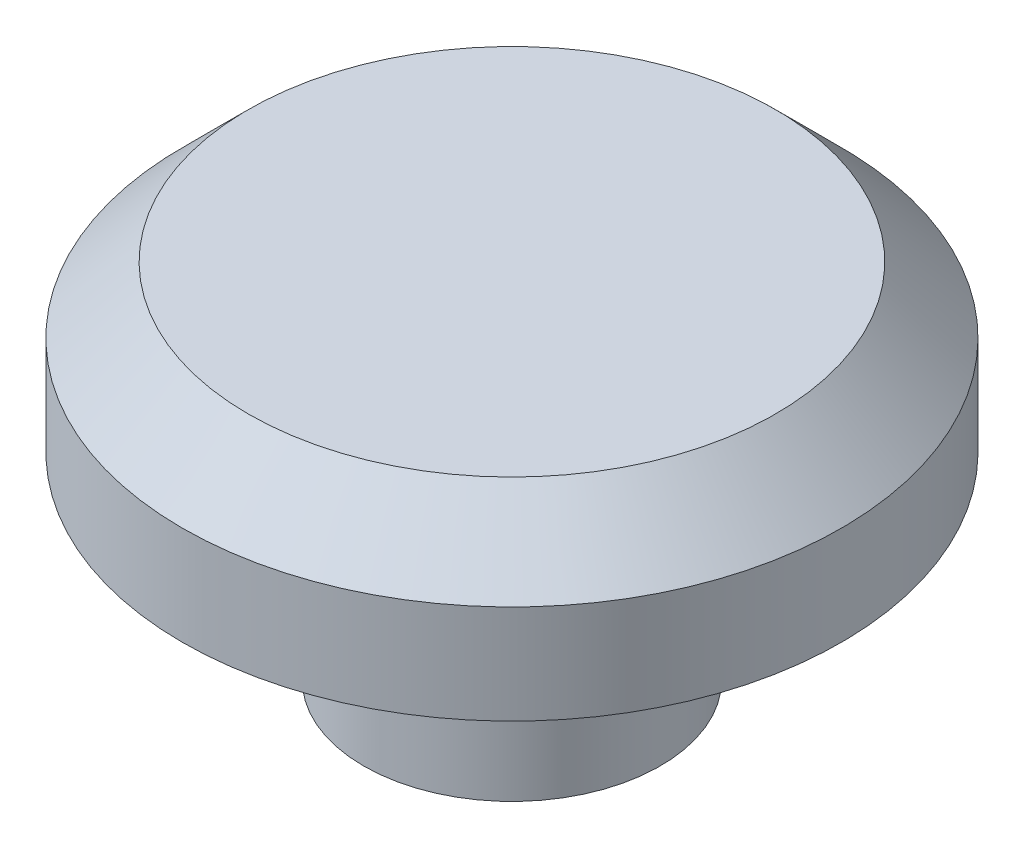
ISO-10303-21;
HEADER;
FILE_DESCRIPTION(('STEP AP214'),'2;1');
FILE_NAME('part.step','',(''),(''),'','','');
FILE_SCHEMA(('AUTOMOTIVE_DESIGN { 1 0 10303 214 1 1 1 1 }'));
ENDSEC;
DATA;
#1=APPLICATION_CONTEXT('core data for automotive mechanical design processes');
#2=APPLICATION_PROTOCOL_DEFINITION('international standard','automotive_design',2000,#1);
#3=PRODUCT_CONTEXT('',#1,'mechanical');
#4=PRODUCT('Part','Part','',(#3));
#5=PRODUCT_RELATED_PRODUCT_CATEGORY('part','',(#4));
#6=PRODUCT_DEFINITION_FORMATION('','',#4);
#7=PRODUCT_DEFINITION_CONTEXT('part definition',#1,'design');
#8=PRODUCT_DEFINITION('design','',#6,#7);
#9=PRODUCT_DEFINITION_SHAPE('','',#8);
#10=(LENGTH_UNIT() NAMED_UNIT(*) SI_UNIT(.MILLI.,.METRE.));
#11=(NAMED_UNIT(*) PLANE_ANGLE_UNIT() SI_UNIT($,.RADIAN.));
#12=(NAMED_UNIT(*) SI_UNIT($,.STERADIAN.) SOLID_ANGLE_UNIT());
#13=UNCERTAINTY_MEASURE_WITH_UNIT(LENGTH_MEASURE(1.E-05),#10,'distance_accuracy_value','');
#14=(GEOMETRIC_REPRESENTATION_CONTEXT(3) GLOBAL_UNCERTAINTY_ASSIGNED_CONTEXT((#13)) GLOBAL_UNIT_ASSIGNED_CONTEXT((#10,
#11,#12)) REPRESENTATION_CONTEXT('',''));
#15=CARTESIAN_POINT('',(0.,0.,0.));
#16=DIRECTION('',(0.,0.,1.));
#17=DIRECTION('',(1.,0.,0.));
#18=AXIS2_PLACEMENT_3D('',#15,#16,#17);
#19=CARTESIAN_POINT('',(0.,-5.,0.));
#20=DIRECTION('',(0.,1.,0.));
#21=DIRECTION('',(0.,0.,1.));
#22=AXIS2_PLACEMENT_3D('',#19,#20,#21);
#23=CYLINDRICAL_SURFACE('',#22,10.);
#24=CARTESIAN_POINT('',(0.,-2.,0.));
#25=DIRECTION('',(0.,1.,0.));
#26=DIRECTION('',(0.,0.,1.));
#27=AXIS2_PLACEMENT_3D('',#24,#25,#26);
#28=CIRCLE('',#27,10.);
#29=CARTESIAN_POINT('',(0.,-2.,10.));
#30=VERTEX_POINT('',#29);
#31=EDGE_CURVE('E10',#30,#30,#28,.F.);
#32=ORIENTED_EDGE('',*,*,#31,.T.);
#33=EDGE_LOOP('',(#32));
#34=FACE_BOUND('',#33,.T.);
#35=CARTESIAN_POINT('',(0.,-5.,0.));
#36=DIRECTION('',(0.,1.,0.));
#37=DIRECTION('',(0.,0.,1.));
#38=AXIS2_PLACEMENT_3D('',#35,#36,#37);
#39=CIRCLE('',#38,10.);
#40=CARTESIAN_POINT('',(0.,-5.,10.));
#41=VERTEX_POINT('',#40);
#42=EDGE_CURVE('E52',#41,#41,#39,.T.);
#43=ORIENTED_EDGE('',*,*,#42,.T.);
#44=EDGE_LOOP('',(#43));
#45=FACE_BOUND('',#44,.T.);
#46=ADVANCED_FACE('F39',(#34,#45),#23,.T.);
#47=CARTESIAN_POINT('',(0.,-5.,0.));
#48=DIRECTION('',(0.,1.,0.));
#49=DIRECTION('',(0.,0.,1.));
#50=AXIS2_PLACEMENT_3D('',#47,#48,#49);
#51=PLANE('',#50);
#52=CARTESIAN_POINT('',(0.,-5.,0.));
#53=DIRECTION('',(0.,1.,0.));
#54=DIRECTION('',(0.,0.,1.));
#55=AXIS2_PLACEMENT_3D('',#52,#53,#54);
#56=CIRCLE('',#55,4.5);
#57=CARTESIAN_POINT('',(0.,-5.,4.5));
#58=VERTEX_POINT('',#57);
#59=EDGE_CURVE('E57',#58,#58,#56,.T.);
#60=ORIENTED_EDGE('',*,*,#59,.T.);
#61=EDGE_LOOP('',(#60));
#62=FACE_BOUND('',#61,.T.);
#63=ORIENTED_EDGE('',*,*,#42,.F.);
#64=EDGE_LOOP('',(#63));
#65=FACE_BOUND('',#64,.T.);
#66=ADVANCED_FACE('F82',(#62,#65),#51,.F.);
#67=CARTESIAN_POINT('',(0.,0.,0.));
#68=DIRECTION('',(0.,1.,0.));
#69=DIRECTION('',(0.,0.,1.));
#70=AXIS2_PLACEMENT_3D('',#67,#68,#69);
#71=PLANE('',#70);
#72=CARTESIAN_POINT('',(0.,0.,0.));
#73=DIRECTION('',(0.,1.,0.));
#74=DIRECTION('',(0.,0.,1.));
#75=AXIS2_PLACEMENT_3D('',#72,#73,#74);
#76=CIRCLE('',#75,8.00000000000001);
#77=CARTESIAN_POINT('',(0.,0.,8.00000000000001));
#78=VERTEX_POINT('',#77);
#79=EDGE_CURVE('E47',#78,#78,#76,.T.);
#80=ORIENTED_EDGE('',*,*,#79,.T.);
#81=EDGE_LOOP('',(#80));
#82=FACE_BOUND('',#81,.T.);
#83=ADVANCED_FACE('F79',(#82),#71,.T.);
#84=CARTESIAN_POINT('',(0.,-11.,0.));
#85=DIRECTION('',(0.,1.,0.));
#86=DIRECTION('',(0.,0.,1.));
#87=AXIS2_PLACEMENT_3D('',#84,#85,#86);
#88=CYLINDRICAL_SURFACE('',#87,4.5);
#89=CARTESIAN_POINT('',(0.,-11.,0.));
#90=DIRECTION('',(0.,1.,0.));
#91=DIRECTION('',(0.,0.,1.));
#92=AXIS2_PLACEMENT_3D('',#89,#90,#91);
#93=CIRCLE('',#92,4.5);
#94=CARTESIAN_POINT('',(0.,-11.,4.5));
#95=VERTEX_POINT('',#94);
#96=EDGE_CURVE('E63',#95,#95,#93,.T.);
#97=ORIENTED_EDGE('',*,*,#96,.T.);
#98=EDGE_LOOP('',(#97));
#99=FACE_BOUND('',#98,.T.);
#100=ORIENTED_EDGE('',*,*,#59,.F.);
#101=EDGE_LOOP('',(#100));
#102=FACE_BOUND('',#101,.T.);
#103=ADVANCED_FACE('F68',(#99,#102),#88,.T.);
#104=CARTESIAN_POINT('',(0.,-11.,0.));
#105=DIRECTION('',(0.,1.,0.));
#106=DIRECTION('',(0.,0.,1.));
#107=AXIS2_PLACEMENT_3D('',#104,#105,#106);
#108=PLANE('',#107);
#109=ORIENTED_EDGE('',*,*,#96,.F.);
#110=EDGE_LOOP('',(#109));
#111=FACE_BOUND('',#110,.T.);
#112=ADVANCED_FACE('F71',(#111),#108,.F.);
#113=CARTESIAN_POINT('',(0.,0.,0.));
#114=DIRECTION('',(0.,-1.,0.));
#115=DIRECTION('',(0.,0.,-1.));
#116=AXIS2_PLACEMENT_3D('',#113,#114,#115);
#117=CONICAL_SURFACE('',#116,8.00000000000001,0.785398163397446);
#118=ORIENTED_EDGE('',*,*,#31,.F.);
#119=EDGE_LOOP('',(#118));
#120=FACE_BOUND('',#119,.T.);
#121=ORIENTED_EDGE('',*,*,#79,.F.);
#122=EDGE_LOOP('',(#121));
#123=FACE_BOUND('',#122,.T.);
#124=ADVANCED_FACE('F41',(#120,#123),#117,.T.);
#125=CLOSED_SHELL('',(#46,#66,#83,#103,#112,#124));
#126=MANIFOLD_SOLID_BREP('B2',#125);
#127=ADVANCED_BREP_SHAPE_REPRESENTATION('',(#18,#126),#14);
#128=SHAPE_DEFINITION_REPRESENTATION(#9,#127);
ENDSEC;
END-ISO-10303-21;
